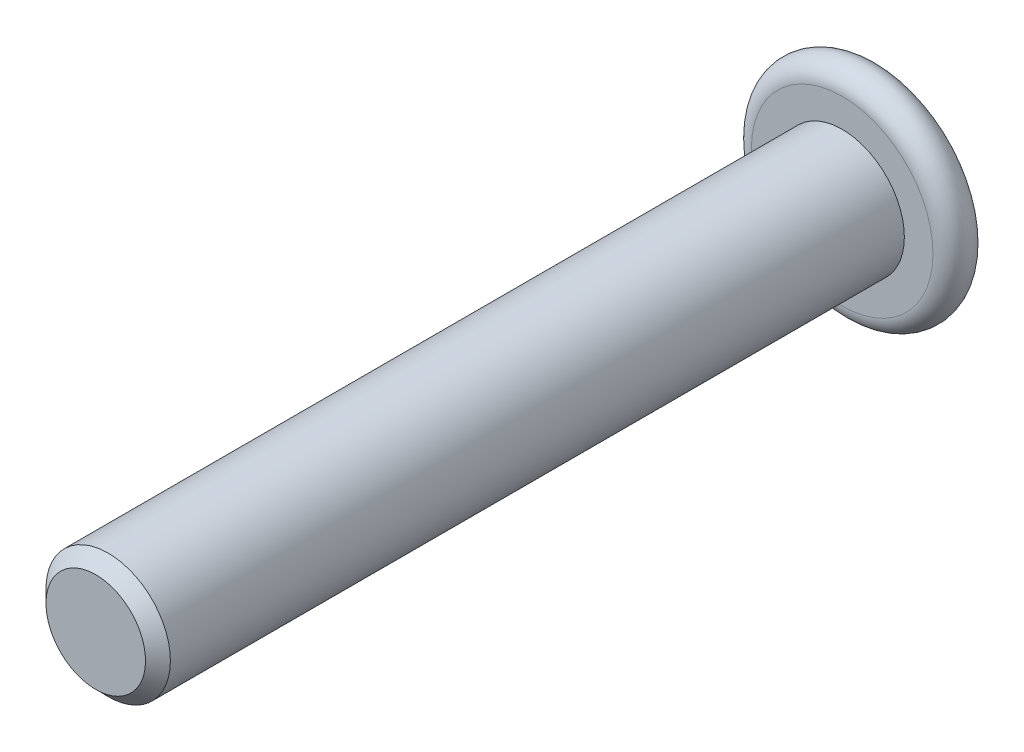
ISO-10303-21;
HEADER;
FILE_DESCRIPTION(('STEP AP214'),'2;1');
FILE_NAME('part.step','',(''),(''),'','','');
FILE_SCHEMA(('AUTOMOTIVE_DESIGN { 1 0 10303 214 1 1 1 1 }'));
ENDSEC;
DATA;
#1=APPLICATION_CONTEXT('core data for automotive mechanical design processes');
#2=APPLICATION_PROTOCOL_DEFINITION('international standard','automotive_design',2000,#1);
#3=PRODUCT_CONTEXT('',#1,'mechanical');
#4=PRODUCT('Part','Part','',(#3));
#5=PRODUCT_RELATED_PRODUCT_CATEGORY('part','',(#4));
#6=PRODUCT_DEFINITION_FORMATION('','',#4);
#7=PRODUCT_DEFINITION_CONTEXT('part definition',#1,'design');
#8=PRODUCT_DEFINITION('design','',#6,#7);
#9=PRODUCT_DEFINITION_SHAPE('','',#8);
#10=(LENGTH_UNIT() NAMED_UNIT(*) SI_UNIT(.MILLI.,.METRE.));
#11=(NAMED_UNIT(*) PLANE_ANGLE_UNIT() SI_UNIT($,.RADIAN.));
#12=(NAMED_UNIT(*) SI_UNIT($,.STERADIAN.) SOLID_ANGLE_UNIT());
#13=UNCERTAINTY_MEASURE_WITH_UNIT(LENGTH_MEASURE(1.E-05),#10,'distance_accuracy_value','');
#14=(GEOMETRIC_REPRESENTATION_CONTEXT(3) GLOBAL_UNCERTAINTY_ASSIGNED_CONTEXT((#13)) GLOBAL_UNIT_ASSIGNED_CONTEXT((#10,
#11,#12)) REPRESENTATION_CONTEXT('',''));
#15=CARTESIAN_POINT('',(0.,0.,0.));
#16=DIRECTION('',(0.,0.,1.));
#17=DIRECTION('',(1.,0.,0.));
#18=AXIS2_PLACEMENT_3D('',#15,#16,#17);
#19=CARTESIAN_POINT('',(0.,0.,30.));
#20=DIRECTION('',(0.,0.,-1.));
#21=DIRECTION('',(-1.,0.,0.));
#22=AXIS2_PLACEMENT_3D('',#19,#20,#21);
#23=CONICAL_SURFACE('',#22,2.,0.7853981625);
#24=CARTESIAN_POINT('',(0.,0.,30.));
#25=DIRECTION('',(0.,0.,1.));
#26=DIRECTION('',(1.,0.,0.));
#27=AXIS2_PLACEMENT_3D('',#24,#25,#26);
#28=CIRCLE('',#27,2.);
#29=CARTESIAN_POINT('',(2.,0.,30.));
#30=VERTEX_POINT('',#29);
#31=EDGE_CURVE('E142',#30,#30,#28,.T.);
#32=ORIENTED_EDGE('',*,*,#31,.F.);
#33=EDGE_LOOP('',(#32));
#34=FACE_BOUND('',#33,.T.);
#35=CARTESIAN_POINT('',(0.,0.,29.5));
#36=DIRECTION('',(0.,0.,-1.));
#37=DIRECTION('',(1.,0.,0.));
#38=AXIS2_PLACEMENT_3D('',#35,#36,#37);
#39=CIRCLE('',#38,2.5);
#40=CARTESIAN_POINT('',(2.5,0.,29.5));
#41=VERTEX_POINT('',#40);
#42=EDGE_CURVE('E143',#41,#41,#39,.T.);
#43=ORIENTED_EDGE('',*,*,#42,.F.);
#44=EDGE_LOOP('',(#43));
#45=FACE_BOUND('',#44,.T.);
#46=ADVANCED_FACE('F16',(#34,#45),#23,.T.);
#47=CARTESIAN_POINT('',(0.,0.,-0.75));
#48=DIRECTION('',(0.,0.,-1.));
#49=DIRECTION('',(-1.,0.,0.));
#50=AXIS2_PLACEMENT_3D('',#47,#48,#49);
#51=TOROIDAL_SURFACE('',#50,3.65,0.75);
#52=CARTESIAN_POINT('',(0.,0.,0.));
#53=DIRECTION('',(0.,0.,1.));
#54=DIRECTION('',(-1.,0.,0.));
#55=AXIS2_PLACEMENT_3D('',#52,#53,#54);
#56=CIRCLE('',#55,3.65);
#57=CARTESIAN_POINT('',(-3.65,0.,0.));
#58=VERTEX_POINT('',#57);
#59=EDGE_CURVE('E123',#58,#58,#56,.T.);
#60=ORIENTED_EDGE('',*,*,#59,.F.);
#61=EDGE_LOOP('',(#60));
#62=FACE_BOUND('',#61,.T.);
#63=CARTESIAN_POINT('',(0.,0.,-1.5));
#64=DIRECTION('',(0.,0.,-1.));
#65=DIRECTION('',(-1.,0.,0.));
#66=AXIS2_PLACEMENT_3D('',#63,#64,#65);
#67=CIRCLE('',#66,3.65);
#68=CARTESIAN_POINT('',(-3.65,0.,-1.5));
#69=VERTEX_POINT('',#68);
#70=EDGE_CURVE('E156',#69,#69,#67,.T.);
#71=ORIENTED_EDGE('',*,*,#70,.F.);
#72=EDGE_LOOP('',(#71));
#73=FACE_BOUND('',#72,.T.);
#74=ADVANCED_FACE('F287',(#62,#73),#51,.T.);
#75=CARTESIAN_POINT('',(0.,0.,1.));
#76=DIRECTION('',(0.,0.,1.));
#77=DIRECTION('',(1.,0.,0.));
#78=AXIS2_PLACEMENT_3D('',#75,#76,#77);
#79=PLANE('',#78);
#80=DIRECTION('',(-0.5,-0.866025403784436,0.));
#81=VECTOR('',#80,1.);
#82=CARTESIAN_POINT('',(0.866025403784433,-1.5,1.));
#83=LINE('',#82,#81);
#84=CARTESIAN_POINT('',(1.73205080756888,0.,1.));
#85=VERTEX_POINT('',#84);
#86=CARTESIAN_POINT('',(0.866025403784433,-1.5,1.));
#87=VERTEX_POINT('',#86);
#88=EDGE_CURVE('E102',#85,#87,#83,.T.);
#89=ORIENTED_EDGE('',*,*,#88,.T.);
#90=DIRECTION('',(-1.,0.,0.));
#91=VECTOR('',#90,1.);
#92=CARTESIAN_POINT('',(-0.86602540378444,-1.5,1.));
#93=LINE('',#92,#91);
#94=CARTESIAN_POINT('',(-0.866025403784443,-1.5,1.));
#95=VERTEX_POINT('',#94);
#96=EDGE_CURVE('E11',#87,#95,#93,.T.);
#97=ORIENTED_EDGE('',*,*,#96,.T.);
#98=DIRECTION('',(-0.5,0.86602540378444,0.));
#99=VECTOR('',#98,1.);
#100=CARTESIAN_POINT('',(-1.73205080756888,0.,1.));
#101=LINE('',#100,#99);
#102=CARTESIAN_POINT('',(-1.73205080756888,0.,1.));
#103=VERTEX_POINT('',#102);
#104=EDGE_CURVE('E133',#95,#103,#101,.T.);
#105=ORIENTED_EDGE('',*,*,#104,.T.);
#106=DIRECTION('',(0.5,0.866025403784438,0.));
#107=VECTOR('',#106,1.);
#108=CARTESIAN_POINT('',(-0.866025403784436,1.5,1.));
#109=LINE('',#108,#107);
#110=CARTESIAN_POINT('',(-0.866025403784436,1.5,1.));
#111=VERTEX_POINT('',#110);
#112=EDGE_CURVE('E160',#103,#111,#109,.T.);
#113=ORIENTED_EDGE('',*,*,#112,.T.);
#114=DIRECTION('',(1.,0.,0.));
#115=VECTOR('',#114,1.);
#116=CARTESIAN_POINT('',(0.86602540378444,1.5,1.));
#117=LINE('',#116,#115);
#118=CARTESIAN_POINT('',(0.866025403784447,1.5,1.));
#119=VERTEX_POINT('',#118);
#120=EDGE_CURVE('E104',#111,#119,#117,.T.);
#121=ORIENTED_EDGE('',*,*,#120,.T.);
#122=DIRECTION('',(0.5,-0.866025403784441,0.));
#123=VECTOR('',#122,1.);
#124=CARTESIAN_POINT('',(1.73205080756888,0.,1.));
#125=LINE('',#124,#123);
#126=EDGE_CURVE('E98',#119,#85,#125,.T.);
#127=ORIENTED_EDGE('',*,*,#126,.T.);
#128=EDGE_LOOP('',(#89,#97,#105,#113,#121,#127));
#129=FACE_BOUND('',#128,.T.);
#130=ADVANCED_FACE('F100',(#129),#79,.F.);
#131=CARTESIAN_POINT('',(-0.86602540378444,-1.5,-1.5));
#132=DIRECTION('',(0.,-1.,0.));
#133=DIRECTION('',(-1.,0.,0.));
#134=AXIS2_PLACEMENT_3D('',#131,#132,#133);
#135=PLANE('',#134);
#136=ORIENTED_EDGE('',*,*,#96,.F.);
#137=DIRECTION('',(0.,0.,-1.));
#138=VECTOR('',#137,1.);
#139=CARTESIAN_POINT('',(0.866025403784433,-1.5,-1.5));
#140=LINE('',#139,#138);
#141=CARTESIAN_POINT('',(0.866025403784433,-1.5,-1.5));
#142=VERTEX_POINT('',#141);
#143=EDGE_CURVE('E109',#87,#142,#140,.T.);
#144=ORIENTED_EDGE('',*,*,#143,.T.);
#145=DIRECTION('',(1.,0.,0.));
#146=VECTOR('',#145,1.);
#147=CARTESIAN_POINT('',(-0.86602540378444,-1.5,-1.5));
#148=LINE('',#147,#146);
#149=CARTESIAN_POINT('',(-0.866025403784443,-1.5,-1.5));
#150=VERTEX_POINT('',#149);
#151=EDGE_CURVE('E129',#150,#142,#148,.T.);
#152=ORIENTED_EDGE('',*,*,#151,.F.);
#153=DIRECTION('',(0.,0.,-1.));
#154=VECTOR('',#153,1.);
#155=CARTESIAN_POINT('',(-0.866025403784443,-1.5,-1.5));
#156=LINE('',#155,#154);
#157=EDGE_CURVE('E20',#95,#150,#156,.T.);
#158=ORIENTED_EDGE('',*,*,#157,.F.);
#159=EDGE_LOOP('',(#136,#144,#152,#158));
#160=FACE_BOUND('',#159,.T.);
#161=ADVANCED_FACE('F174',(#160),#135,.F.);
#162=CARTESIAN_POINT('',(-1.73205080756888,0.,-1.5));
#163=DIRECTION('',(-0.86602540378444,-0.5,0.));
#164=DIRECTION('',(-0.5,0.86602540378444,0.));
#165=AXIS2_PLACEMENT_3D('',#162,#163,#164);
#166=PLANE('',#165);
#167=ORIENTED_EDGE('',*,*,#104,.F.);
#168=ORIENTED_EDGE('',*,*,#157,.T.);
#169=DIRECTION('',(0.5,-0.86602540378444,0.));
#170=VECTOR('',#169,1.);
#171=CARTESIAN_POINT('',(-1.73205080756888,0.,-1.5));
#172=LINE('',#171,#170);
#173=CARTESIAN_POINT('',(-1.73205080756888,0.,-1.5));
#174=VERTEX_POINT('',#173);
#175=EDGE_CURVE('E148',#174,#150,#172,.T.);
#176=ORIENTED_EDGE('',*,*,#175,.F.);
#177=DIRECTION('',(0.,0.,-1.));
#178=VECTOR('',#177,1.);
#179=CARTESIAN_POINT('',(-1.73205080756888,0.,-1.5));
#180=LINE('',#179,#178);
#181=EDGE_CURVE('E157',#103,#174,#180,.T.);
#182=ORIENTED_EDGE('',*,*,#181,.F.);
#183=EDGE_LOOP('',(#167,#168,#176,#182));
#184=FACE_BOUND('',#183,.T.);
#185=ADVANCED_FACE('F314',(#184),#166,.F.);
#186=CARTESIAN_POINT('',(-0.866025403784436,1.5,-1.5));
#187=DIRECTION('',(-0.866025403784438,0.5,0.));
#188=DIRECTION('',(0.,0.,1.));
#189=AXIS2_PLACEMENT_3D('',#186,#187,#188);
#190=PLANE('',#189);
#191=ORIENTED_EDGE('',*,*,#112,.F.);
#192=ORIENTED_EDGE('',*,*,#181,.T.);
#193=DIRECTION('',(-0.5,-0.866025403784438,0.));
#194=VECTOR('',#193,1.);
#195=CARTESIAN_POINT('',(-0.866025403784436,1.5,-1.5));
#196=LINE('',#195,#194);
#197=CARTESIAN_POINT('',(-0.866025403784436,1.5,-1.5));
#198=VERTEX_POINT('',#197);
#199=EDGE_CURVE('E147',#198,#174,#196,.T.);
#200=ORIENTED_EDGE('',*,*,#199,.F.);
#201=DIRECTION('',(0.,0.,-1.));
#202=VECTOR('',#201,1.);
#203=CARTESIAN_POINT('',(-0.866025403784436,1.5,-1.5));
#204=LINE('',#203,#202);
#205=EDGE_CURVE('E187',#111,#198,#204,.T.);
#206=ORIENTED_EDGE('',*,*,#205,.F.);
#207=EDGE_LOOP('',(#191,#192,#200,#206));
#208=FACE_BOUND('',#207,.T.);
#209=ADVANCED_FACE('F202',(#208),#190,.F.);
#210=CARTESIAN_POINT('',(0.86602540378444,1.5,-1.5));
#211=DIRECTION('',(0.,1.,0.));
#212=DIRECTION('',(1.,0.,0.));
#213=AXIS2_PLACEMENT_3D('',#210,#211,#212);
#214=PLANE('',#213);
#215=ORIENTED_EDGE('',*,*,#120,.F.);
#216=ORIENTED_EDGE('',*,*,#205,.T.);
#217=DIRECTION('',(-1.,0.,0.));
#218=VECTOR('',#217,1.);
#219=CARTESIAN_POINT('',(0.86602540378444,1.5,-1.5));
#220=LINE('',#219,#218);
#221=CARTESIAN_POINT('',(0.866025403784447,1.5,-1.5));
#222=VERTEX_POINT('',#221);
#223=EDGE_CURVE('E137',#222,#198,#220,.T.);
#224=ORIENTED_EDGE('',*,*,#223,.F.);
#225=DIRECTION('',(0.,0.,-1.));
#226=VECTOR('',#225,1.);
#227=CARTESIAN_POINT('',(0.866025403784447,1.5,-1.5));
#228=LINE('',#227,#226);
#229=EDGE_CURVE('E108',#119,#222,#228,.T.);
#230=ORIENTED_EDGE('',*,*,#229,.F.);
#231=EDGE_LOOP('',(#215,#216,#224,#230));
#232=FACE_BOUND('',#231,.T.);
#233=ADVANCED_FACE('F204',(#232),#214,.F.);
#234=CARTESIAN_POINT('',(1.73205080756888,0.,-1.5));
#235=DIRECTION('',(0.866025403784441,0.5,0.));
#236=DIRECTION('',(0.,0.,-1.));
#237=AXIS2_PLACEMENT_3D('',#234,#235,#236);
#238=PLANE('',#237);
#239=ORIENTED_EDGE('',*,*,#126,.F.);
#240=ORIENTED_EDGE('',*,*,#229,.T.);
#241=DIRECTION('',(-0.5,0.866025403784441,0.));
#242=VECTOR('',#241,1.);
#243=CARTESIAN_POINT('',(1.73205080756888,0.,-1.5));
#244=LINE('',#243,#242);
#245=CARTESIAN_POINT('',(1.73205080756888,0.,-1.5));
#246=VERTEX_POINT('',#245);
#247=EDGE_CURVE('E116',#246,#222,#244,.T.);
#248=ORIENTED_EDGE('',*,*,#247,.F.);
#249=DIRECTION('',(0.,0.,-1.));
#250=VECTOR('',#249,1.);
#251=CARTESIAN_POINT('',(1.73205080756888,0.,-1.5));
#252=LINE('',#251,#250);
#253=EDGE_CURVE('E113',#85,#246,#252,.T.);
#254=ORIENTED_EDGE('',*,*,#253,.F.);
#255=EDGE_LOOP('',(#239,#240,#248,#254));
#256=FACE_BOUND('',#255,.T.);
#257=ADVANCED_FACE('F114',(#256),#238,.F.);
#258=CARTESIAN_POINT('',(0.866025403784433,-1.5,-1.5));
#259=DIRECTION('',(0.866025403784436,-0.5,0.));
#260=DIRECTION('',(0.,0.,-1.));
#261=AXIS2_PLACEMENT_3D('',#258,#259,#260);
#262=PLANE('',#261);
#263=ORIENTED_EDGE('',*,*,#88,.F.);
#264=ORIENTED_EDGE('',*,*,#253,.T.);
#265=DIRECTION('',(0.5,0.866025403784436,0.));
#266=VECTOR('',#265,1.);
#267=CARTESIAN_POINT('',(0.866025403784433,-1.5,-1.5));
#268=LINE('',#267,#266);
#269=EDGE_CURVE('E138',#142,#246,#268,.T.);
#270=ORIENTED_EDGE('',*,*,#269,.F.);
#271=ORIENTED_EDGE('',*,*,#143,.F.);
#272=EDGE_LOOP('',(#263,#264,#270,#271));
#273=FACE_BOUND('',#272,.T.);
#274=ADVANCED_FACE('F18',(#273),#262,.F.);
#275=CARTESIAN_POINT('',(0.,0.,0.));
#276=DIRECTION('',(0.,0.,-1.));
#277=DIRECTION('',(0.,-1.,0.));
#278=AXIS2_PLACEMENT_3D('',#275,#276,#277);
#279=PLANE('',#278);
#280=CARTESIAN_POINT('',(0.,0.,0.));
#281=DIRECTION('',(0.,0.,1.));
#282=DIRECTION('',(1.,0.,0.));
#283=AXIS2_PLACEMENT_3D('',#280,#281,#282);
#284=CIRCLE('',#283,2.5);
#285=CARTESIAN_POINT('',(2.5,0.,0.));
#286=VERTEX_POINT('',#285);
#287=EDGE_CURVE('E139',#286,#286,#284,.T.);
#288=ORIENTED_EDGE('',*,*,#287,.F.);
#289=EDGE_LOOP('',(#288));
#290=FACE_BOUND('',#289,.T.);
#291=ORIENTED_EDGE('',*,*,#59,.T.);
#292=EDGE_LOOP('',(#291));
#293=FACE_BOUND('',#292,.T.);
#294=ADVANCED_FACE('F278',(#290,#293),#279,.F.);
#295=CARTESIAN_POINT('',(0.,0.,-1.5));
#296=DIRECTION('',(0.,0.,-1.));
#297=DIRECTION('',(0.,-1.,0.));
#298=AXIS2_PLACEMENT_3D('',#295,#296,#297);
#299=PLANE('',#298);
#300=ORIENTED_EDGE('',*,*,#269,.T.);
#301=ORIENTED_EDGE('',*,*,#247,.T.);
#302=ORIENTED_EDGE('',*,*,#223,.T.);
#303=ORIENTED_EDGE('',*,*,#199,.T.);
#304=ORIENTED_EDGE('',*,*,#175,.T.);
#305=ORIENTED_EDGE('',*,*,#151,.T.);
#306=EDGE_LOOP('',(#300,#301,#302,#303,#304,#305));
#307=FACE_BOUND('',#306,.T.);
#308=ORIENTED_EDGE('',*,*,#70,.T.);
#309=EDGE_LOOP('',(#308));
#310=FACE_BOUND('',#309,.T.);
#311=ADVANCED_FACE('F169',(#307,#310),#299,.T.);
#312=CARTESIAN_POINT('',(0.,0.,30.));
#313=DIRECTION('',(0.,0.,1.));
#314=DIRECTION('',(1.,0.,0.));
#315=AXIS2_PLACEMENT_3D('',#312,#313,#314);
#316=PLANE('',#315);
#317=ORIENTED_EDGE('',*,*,#31,.T.);
#318=EDGE_LOOP('',(#317));
#319=FACE_BOUND('',#318,.T.);
#320=ADVANCED_FACE('F266',(#319),#316,.T.);
#321=CARTESIAN_POINT('',(0.,0.,30.));
#322=DIRECTION('',(0.,0.,-1.));
#323=DIRECTION('',(-1.,0.,0.));
#324=AXIS2_PLACEMENT_3D('',#321,#322,#323);
#325=CYLINDRICAL_SURFACE('',#324,2.5);
#326=ORIENTED_EDGE('',*,*,#287,.T.);
#327=EDGE_LOOP('',(#326));
#328=FACE_BOUND('',#327,.T.);
#329=ORIENTED_EDGE('',*,*,#42,.T.);
#330=EDGE_LOOP('',(#329));
#331=FACE_BOUND('',#330,.T.);
#332=ADVANCED_FACE('F271',(#328,#331),#325,.T.);
#333=CLOSED_SHELL('',(#46,#74,#130,#161,#185,#209,#233,#257,#274,#294,#311,#320,#332));
#334=MANIFOLD_SOLID_BREP('B1',#333);
#335=ADVANCED_BREP_SHAPE_REPRESENTATION('',(#18,#334),#14);
#336=SHAPE_DEFINITION_REPRESENTATION(#9,#335);
ENDSEC;
END-ISO-10303-21;
